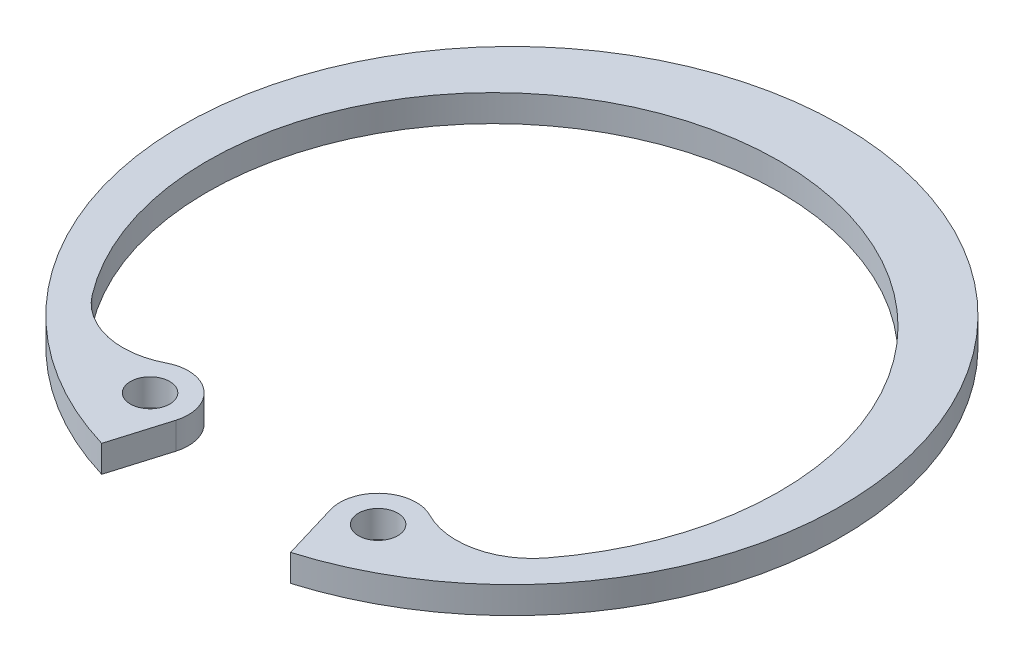
ISO-10303-21;
HEADER;
FILE_DESCRIPTION(('STEP AP214'),'2;1');
FILE_NAME('part.step','',(''),(''),'','','');
FILE_SCHEMA(('AUTOMOTIVE_DESIGN { 1 0 10303 214 1 1 1 1 }'));
ENDSEC;
DATA;
#1=APPLICATION_CONTEXT('core data for automotive mechanical design processes');
#2=APPLICATION_PROTOCOL_DEFINITION('international standard','automotive_design',2000,#1);
#3=PRODUCT_CONTEXT('',#1,'mechanical');
#4=PRODUCT('Part','Part','',(#3));
#5=PRODUCT_RELATED_PRODUCT_CATEGORY('part','',(#4));
#6=PRODUCT_DEFINITION_FORMATION('','',#4);
#7=PRODUCT_DEFINITION_CONTEXT('part definition',#1,'design');
#8=PRODUCT_DEFINITION('design','',#6,#7);
#9=PRODUCT_DEFINITION_SHAPE('','',#8);
#10=(LENGTH_UNIT() NAMED_UNIT(*) SI_UNIT(.MILLI.,.METRE.));
#11=(NAMED_UNIT(*) PLANE_ANGLE_UNIT() SI_UNIT($,.RADIAN.));
#12=(NAMED_UNIT(*) SI_UNIT($,.STERADIAN.) SOLID_ANGLE_UNIT());
#13=UNCERTAINTY_MEASURE_WITH_UNIT(LENGTH_MEASURE(1.E-05),#10,'distance_accuracy_value','');
#14=(GEOMETRIC_REPRESENTATION_CONTEXT(3) GLOBAL_UNCERTAINTY_ASSIGNED_CONTEXT((#13)) GLOBAL_UNIT_ASSIGNED_CONTEXT((#10,
#11,#12)) REPRESENTATION_CONTEXT('',''));
#15=CARTESIAN_POINT('',(0.,0.,0.));
#16=DIRECTION('',(0.,0.,1.));
#17=DIRECTION('',(1.,0.,0.));
#18=AXIS2_PLACEMENT_3D('',#15,#16,#17);
#19=CARTESIAN_POINT('',(0.,1.3,0.9));
#20=DIRECTION('',(0.,-1.,0.));
#21=DIRECTION('',(0.,0.,-1.));
#22=AXIS2_PLACEMENT_3D('',#19,#20,#21);
#23=CYLINDRICAL_SURFACE('',#22,13.85);
#24=CARTESIAN_POINT('',(0.,0.,0.9));
#25=DIRECTION('',(0.,1.,0.));
#26=DIRECTION('',(0.,0.,1.));
#27=AXIS2_PLACEMENT_3D('',#24,#25,#26);
#28=CIRCLE('',#27,13.85);
#29=CARTESIAN_POINT('',(11.0061736504425,0.,9.30753480969928));
#30=VERTEX_POINT('',#29);
#31=CARTESIAN_POINT('',(-11.0061736504425,0.,9.30753480969928));
#32=VERTEX_POINT('',#31);
#33=EDGE_CURVE('E149',#30,#32,#28,.T.);
#34=ORIENTED_EDGE('',*,*,#33,.F.);
#35=DIRECTION('',(0.,-1.,0.));
#36=VECTOR('',#35,1.);
#37=CARTESIAN_POINT('',(11.0061736504425,1.3,9.30753480969928));
#38=LINE('',#37,#36);
#39=CARTESIAN_POINT('',(11.0061736504425,1.3,9.30753480969928));
#40=VERTEX_POINT('',#39);
#41=EDGE_CURVE('E11',#40,#30,#38,.T.);
#42=ORIENTED_EDGE('',*,*,#41,.F.);
#43=CARTESIAN_POINT('',(0.,1.3,0.9));
#44=DIRECTION('',(0.,1.,0.));
#45=DIRECTION('',(0.,0.,1.));
#46=AXIS2_PLACEMENT_3D('',#43,#44,#45);
#47=CIRCLE('',#46,13.85);
#48=CARTESIAN_POINT('',(-11.0061736504425,1.3,9.30753480969928));
#49=VERTEX_POINT('',#48);
#50=EDGE_CURVE('E248',#40,#49,#47,.T.);
#51=ORIENTED_EDGE('',*,*,#50,.T.);
#52=DIRECTION('',(0.,-1.,0.));
#53=VECTOR('',#52,1.);
#54=CARTESIAN_POINT('',(-11.0061736504425,1.3,9.30753480969928));
#55=LINE('',#54,#53);
#56=EDGE_CURVE('E59',#49,#32,#55,.T.);
#57=ORIENTED_EDGE('',*,*,#56,.T.);
#58=EDGE_LOOP('',(#34,#42,#51,#57));
#59=FACE_BOUND('',#58,.T.);
#60=ADVANCED_FACE('F41',(#59),#23,.F.);
#61=CARTESIAN_POINT('',(8.06589621314017,1.3,7.06147857894929));
#62=DIRECTION('',(0.,-1.,0.));
#63=DIRECTION('',(0.,0.,-1.));
#64=AXIS2_PLACEMENT_3D('',#61,#62,#63);
#65=CYLINDRICAL_SURFACE('',#64,3.7);
#66=CARTESIAN_POINT('',(8.06589621314017,0.,7.06147857894929));
#67=DIRECTION('',(0.,1.,0.));
#68=DIRECTION('',(0.,0.,1.));
#69=AXIS2_PLACEMENT_3D('',#66,#67,#68);
#70=CIRCLE('',#69,3.7);
#71=CARTESIAN_POINT('',(6.36678517420886,0.,10.3482736254013));
#72=VERTEX_POINT('',#71);
#73=EDGE_CURVE('E152',#30,#72,#70,.F.);
#74=ORIENTED_EDGE('',*,*,#73,.T.);
#75=DIRECTION('',(0.,-1.,0.));
#76=VECTOR('',#75,1.);
#77=CARTESIAN_POINT('',(6.36678517420886,1.3,10.3482736254013));
#78=LINE('',#77,#76);
#79=CARTESIAN_POINT('',(6.36678517420886,1.3,10.3482736254013));
#80=VERTEX_POINT('',#79);
#81=EDGE_CURVE('E51',#80,#72,#78,.T.);
#82=ORIENTED_EDGE('',*,*,#81,.F.);
#83=CARTESIAN_POINT('',(8.06589621314017,1.3,7.06147857894929));
#84=DIRECTION('',(0.,1.,0.));
#85=DIRECTION('',(0.,0.,1.));
#86=AXIS2_PLACEMENT_3D('',#83,#84,#85);
#87=CIRCLE('',#86,3.7);
#88=EDGE_CURVE('E251',#40,#80,#87,.F.);
#89=ORIENTED_EDGE('',*,*,#88,.F.);
#90=ORIENTED_EDGE('',*,*,#41,.T.);
#91=EDGE_LOOP('',(#74,#82,#89,#90));
#92=FACE_BOUND('',#91,.T.);
#93=ADVANCED_FACE('F206',(#92),#65,.F.);
#94=CARTESIAN_POINT('',(5.51722965474321,1.3,11.9916711486274));
#95=DIRECTION('',(0.,-1.,0.));
#96=DIRECTION('',(0.,0.,-1.));
#97=AXIS2_PLACEMENT_3D('',#94,#95,#96);
#98=CYLINDRICAL_SURFACE('',#97,1.85);
#99=CARTESIAN_POINT('',(5.51722965474321,0.,11.9916711486274));
#100=DIRECTION('',(0.,1.,0.));
#101=DIRECTION('',(0.,0.,1.));
#102=AXIS2_PLACEMENT_3D('',#99,#100,#101);
#103=CIRCLE('',#102,1.85);
#104=CARTESIAN_POINT('',(3.74479479073792,0.,12.5217415711738));
#105=VERTEX_POINT('',#104);
#106=EDGE_CURVE('E156',#72,#105,#103,.T.);
#107=ORIENTED_EDGE('',*,*,#106,.T.);
#108=DIRECTION('',(0.,-1.,0.));
#109=VECTOR('',#108,1.);
#110=CARTESIAN_POINT('',(3.74479479073792,1.3,12.5217415711738));
#111=LINE('',#110,#109);
#112=CARTESIAN_POINT('',(3.74479479073792,1.3,12.5217415711738));
#113=VERTEX_POINT('',#112);
#114=EDGE_CURVE('E192',#113,#105,#111,.T.);
#115=ORIENTED_EDGE('',*,*,#114,.F.);
#116=CARTESIAN_POINT('',(5.51722965474321,1.3,11.9916711486274));
#117=DIRECTION('',(0.,1.,0.));
#118=DIRECTION('',(0.,0.,1.));
#119=AXIS2_PLACEMENT_3D('',#116,#117,#118);
#120=CIRCLE('',#119,1.85);
#121=EDGE_CURVE('E202',#80,#113,#120,.T.);
#122=ORIENTED_EDGE('',*,*,#121,.F.);
#123=ORIENTED_EDGE('',*,*,#81,.T.);
#124=EDGE_LOOP('',(#107,#115,#122,#123));
#125=FACE_BOUND('',#124,.T.);
#126=ADVANCED_FACE('F199',(#125),#98,.T.);
#127=CARTESIAN_POINT('',(0.,1.3,0.));
#128=DIRECTION('',(0.958072899462319,0.,-0.286524552727799));
#129=DIRECTION('',(-0.286524552727799,0.,-0.958072899462319));
#130=AXIS2_PLACEMENT_3D('',#127,#128,#129);
#131=PLANE('',#130);
#132=DIRECTION('',(0.286524552727799,0.,0.958072899462319));
#133=VECTOR('',#132,1.);
#134=CARTESIAN_POINT('',(0.,0.,0.));
#135=LINE('',#134,#133);
#136=CARTESIAN_POINT('',(4.5700666160084,0.,15.281262746424));
#137=VERTEX_POINT('',#136);
#138=EDGE_CURVE('E160',#105,#137,#135,.T.);
#139=ORIENTED_EDGE('',*,*,#138,.T.);
#140=DIRECTION('',(0.,-1.,0.));
#141=VECTOR('',#140,1.);
#142=CARTESIAN_POINT('',(4.5700666160084,1.3,15.281262746424));
#143=LINE('',#142,#141);
#144=CARTESIAN_POINT('',(4.5700666160084,1.3,15.281262746424));
#145=VERTEX_POINT('',#144);
#146=EDGE_CURVE('E188',#145,#137,#143,.T.);
#147=ORIENTED_EDGE('',*,*,#146,.F.);
#148=DIRECTION('',(0.286524552727799,0.,0.958072899462319));
#149=VECTOR('',#148,1.);
#150=CARTESIAN_POINT('',(0.,1.3,0.));
#151=LINE('',#150,#149);
#152=EDGE_CURVE('E258',#113,#145,#151,.T.);
#153=ORIENTED_EDGE('',*,*,#152,.F.);
#154=ORIENTED_EDGE('',*,*,#114,.T.);
#155=EDGE_LOOP('',(#139,#147,#153,#154));
#156=FACE_BOUND('',#155,.T.);
#157=ADVANCED_FACE('F218',(#156),#131,.F.);
#158=CARTESIAN_POINT('',(0.,1.3,0.));
#159=DIRECTION('',(0.,-1.,0.));
#160=DIRECTION('',(0.,0.,-1.));
#161=AXIS2_PLACEMENT_3D('',#158,#159,#160);
#162=CYLINDRICAL_SURFACE('',#161,15.95);
#163=CARTESIAN_POINT('',(0.,0.,0.));
#164=DIRECTION('',(0.,1.,0.));
#165=DIRECTION('',(0.,0.,1.));
#166=AXIS2_PLACEMENT_3D('',#163,#164,#165);
#167=CIRCLE('',#166,15.95);
#168=CARTESIAN_POINT('',(-4.5700666160084,0.,15.281262746424));
#169=VERTEX_POINT('',#168);
#170=EDGE_CURVE('E164',#137,#169,#167,.T.);
#171=ORIENTED_EDGE('',*,*,#170,.T.);
#172=DIRECTION('',(0.,-1.,0.));
#173=VECTOR('',#172,1.);
#174=CARTESIAN_POINT('',(-4.5700666160084,1.3,15.281262746424));
#175=LINE('',#174,#173);
#176=CARTESIAN_POINT('',(-4.5700666160084,1.3,15.281262746424));
#177=VERTEX_POINT('',#176);
#178=EDGE_CURVE('E119',#177,#169,#175,.T.);
#179=ORIENTED_EDGE('',*,*,#178,.F.);
#180=CARTESIAN_POINT('',(0.,1.3,0.));
#181=DIRECTION('',(0.,1.,0.));
#182=DIRECTION('',(0.,0.,1.));
#183=AXIS2_PLACEMENT_3D('',#180,#181,#182);
#184=CIRCLE('',#183,15.95);
#185=EDGE_CURVE('E129',#145,#177,#184,.T.);
#186=ORIENTED_EDGE('',*,*,#185,.F.);
#187=ORIENTED_EDGE('',*,*,#146,.T.);
#188=EDGE_LOOP('',(#171,#179,#186,#187));
#189=FACE_BOUND('',#188,.T.);
#190=ADVANCED_FACE('F221',(#189),#162,.T.);
#191=CARTESIAN_POINT('',(0.,1.3,0.));
#192=DIRECTION('',(0.958072899462319,0.,0.286524552727799));
#193=DIRECTION('',(0.286524552727799,0.,-0.958072899462319));
#194=AXIS2_PLACEMENT_3D('',#191,#192,#193);
#195=PLANE('',#194);
#196=DIRECTION('',(-0.286524552727799,0.,0.958072899462319));
#197=VECTOR('',#196,1.);
#198=CARTESIAN_POINT('',(0.,0.,0.));
#199=LINE('',#198,#197);
#200=CARTESIAN_POINT('',(-3.74479479073792,0.,12.5217415711738));
#201=VERTEX_POINT('',#200);
#202=EDGE_CURVE('E114',#201,#169,#199,.T.);
#203=ORIENTED_EDGE('',*,*,#202,.F.);
#204=DIRECTION('',(0.,-1.,0.));
#205=VECTOR('',#204,1.);
#206=CARTESIAN_POINT('',(-3.74479479073792,1.3,12.5217415711738));
#207=LINE('',#206,#205);
#208=CARTESIAN_POINT('',(-3.74479479073792,1.3,12.5217415711738));
#209=VERTEX_POINT('',#208);
#210=EDGE_CURVE('E109',#209,#201,#207,.T.);
#211=ORIENTED_EDGE('',*,*,#210,.F.);
#212=DIRECTION('',(-0.286524552727799,0.,0.958072899462319));
#213=VECTOR('',#212,1.);
#214=CARTESIAN_POINT('',(0.,1.3,0.));
#215=LINE('',#214,#213);
#216=EDGE_CURVE('E112',#209,#177,#215,.T.);
#217=ORIENTED_EDGE('',*,*,#216,.T.);
#218=ORIENTED_EDGE('',*,*,#178,.T.);
#219=EDGE_LOOP('',(#203,#211,#217,#218));
#220=FACE_BOUND('',#219,.T.);
#221=ADVANCED_FACE('F111',(#220),#195,.T.);
#222=CARTESIAN_POINT('',(-5.51722965474321,1.3,11.9916711486274));
#223=DIRECTION('',(0.,-1.,0.));
#224=DIRECTION('',(0.,0.,-1.));
#225=AXIS2_PLACEMENT_3D('',#222,#223,#224);
#226=CYLINDRICAL_SURFACE('',#225,1.85);
#227=CARTESIAN_POINT('',(-5.51722965474321,0.,11.9916711486274));
#228=DIRECTION('',(0.,1.,0.));
#229=DIRECTION('',(0.,0.,1.));
#230=AXIS2_PLACEMENT_3D('',#227,#228,#229);
#231=CIRCLE('',#230,1.85);
#232=CARTESIAN_POINT('',(-6.36678517420886,0.,10.3482736254013));
#233=VERTEX_POINT('',#232);
#234=EDGE_CURVE('E170',#233,#201,#231,.F.);
#235=ORIENTED_EDGE('',*,*,#234,.F.);
#236=DIRECTION('',(0.,-1.,0.));
#237=VECTOR('',#236,1.);
#238=CARTESIAN_POINT('',(-6.36678517420886,1.3,10.3482736254013));
#239=LINE('',#238,#237);
#240=CARTESIAN_POINT('',(-6.36678517420886,1.3,10.3482736254013));
#241=VERTEX_POINT('',#240);
#242=EDGE_CURVE('E84',#241,#233,#239,.T.);
#243=ORIENTED_EDGE('',*,*,#242,.F.);
#244=CARTESIAN_POINT('',(-5.51722965474321,1.3,11.9916711486274));
#245=DIRECTION('',(0.,1.,0.));
#246=DIRECTION('',(0.,0.,1.));
#247=AXIS2_PLACEMENT_3D('',#244,#245,#246);
#248=CIRCLE('',#247,1.85);
#249=EDGE_CURVE('E127',#241,#209,#248,.F.);
#250=ORIENTED_EDGE('',*,*,#249,.T.);
#251=ORIENTED_EDGE('',*,*,#210,.T.);
#252=EDGE_LOOP('',(#235,#243,#250,#251));
#253=FACE_BOUND('',#252,.T.);
#254=ADVANCED_FACE('F133',(#253),#226,.T.);
#255=CARTESIAN_POINT('',(-8.06589621314017,1.3,7.06147857894929));
#256=DIRECTION('',(0.,-1.,0.));
#257=DIRECTION('',(0.,0.,-1.));
#258=AXIS2_PLACEMENT_3D('',#255,#256,#257);
#259=CYLINDRICAL_SURFACE('',#258,3.7);
#260=CARTESIAN_POINT('',(-8.06589621314017,0.,7.06147857894929));
#261=DIRECTION('',(0.,1.,0.));
#262=DIRECTION('',(0.,0.,1.));
#263=AXIS2_PLACEMENT_3D('',#260,#261,#262);
#264=CIRCLE('',#263,3.7);
#265=EDGE_CURVE('E173',#32,#233,#264,.T.);
#266=ORIENTED_EDGE('',*,*,#265,.F.);
#267=ORIENTED_EDGE('',*,*,#56,.F.);
#268=CARTESIAN_POINT('',(-8.06589621314017,1.3,7.06147857894929));
#269=DIRECTION('',(0.,1.,0.));
#270=DIRECTION('',(0.,0.,1.));
#271=AXIS2_PLACEMENT_3D('',#268,#269,#270);
#272=CIRCLE('',#271,3.7);
#273=EDGE_CURVE('E135',#49,#241,#272,.T.);
#274=ORIENTED_EDGE('',*,*,#273,.T.);
#275=ORIENTED_EDGE('',*,*,#242,.T.);
#276=EDGE_LOOP('',(#266,#267,#274,#275));
#277=FACE_BOUND('',#276,.T.);
#278=ADVANCED_FACE('F230',(#277),#259,.F.);
#279=CARTESIAN_POINT('',(5.51722965474321,1.3,11.9916711486274));
#280=DIRECTION('',(0.,-1.,0.));
#281=DIRECTION('',(0.,0.,-1.));
#282=AXIS2_PLACEMENT_3D('',#279,#280,#281);
#283=CYLINDRICAL_SURFACE('',#282,0.949999999999999);
#284=CARTESIAN_POINT('',(5.51722965474321,1.3,11.9916711486274));
#285=DIRECTION('',(0.,1.,0.));
#286=DIRECTION('',(0.,0.,1.));
#287=AXIS2_PLACEMENT_3D('',#284,#285,#286);
#288=CIRCLE('',#287,0.949999999999999);
#289=CARTESIAN_POINT('',(5.51722965474321,1.3,12.9416711486274));
#290=VERTEX_POINT('',#289);
#291=EDGE_CURVE('E181',#290,#290,#288,.T.);
#292=ORIENTED_EDGE('',*,*,#291,.T.);
#293=EDGE_LOOP('',(#292));
#294=FACE_BOUND('',#293,.T.);
#295=CARTESIAN_POINT('',(5.51722965474321,0.,11.9916711486274));
#296=DIRECTION('',(0.,1.,0.));
#297=DIRECTION('',(0.,0.,1.));
#298=AXIS2_PLACEMENT_3D('',#295,#296,#297);
#299=CIRCLE('',#298,0.949999999999999);
#300=CARTESIAN_POINT('',(5.51722965474321,0.,12.9416711486274));
#301=VERTEX_POINT('',#300);
#302=EDGE_CURVE('E145',#301,#301,#299,.T.);
#303=ORIENTED_EDGE('',*,*,#302,.F.);
#304=EDGE_LOOP('',(#303));
#305=FACE_BOUND('',#304,.T.);
#306=ADVANCED_FACE('F43',(#294,#305),#283,.F.);
#307=CARTESIAN_POINT('',(-5.51722965474321,1.3,11.9916711486274));
#308=DIRECTION('',(0.,-1.,0.));
#309=DIRECTION('',(0.,0.,-1.));
#310=AXIS2_PLACEMENT_3D('',#307,#308,#309);
#311=CYLINDRICAL_SURFACE('',#310,0.949999999999999);
#312=CARTESIAN_POINT('',(-5.51722965474321,1.3,11.9916711486274));
#313=DIRECTION('',(0.,1.,0.));
#314=DIRECTION('',(0.,0.,1.));
#315=AXIS2_PLACEMENT_3D('',#312,#313,#314);
#316=CIRCLE('',#315,0.949999999999999);
#317=CARTESIAN_POINT('',(-5.51722965474321,1.3,12.9416711486274));
#318=VERTEX_POINT('',#317);
#319=EDGE_CURVE('E138',#318,#318,#316,.F.);
#320=ORIENTED_EDGE('',*,*,#319,.F.);
#321=EDGE_LOOP('',(#320));
#322=FACE_BOUND('',#321,.T.);
#323=CARTESIAN_POINT('',(-5.51722965474321,0.,11.9916711486274));
#324=DIRECTION('',(0.,1.,0.));
#325=DIRECTION('',(0.,0.,1.));
#326=AXIS2_PLACEMENT_3D('',#323,#324,#325);
#327=CIRCLE('',#326,0.949999999999999);
#328=CARTESIAN_POINT('',(-5.51722965474321,0.,12.9416711486274));
#329=VERTEX_POINT('',#328);
#330=EDGE_CURVE('E177',#329,#329,#327,.F.);
#331=ORIENTED_EDGE('',*,*,#330,.T.);
#332=EDGE_LOOP('',(#331));
#333=FACE_BOUND('',#332,.T.);
#334=ADVANCED_FACE('F233',(#322,#333),#311,.F.);
#335=CARTESIAN_POINT('',(0.,1.3,0.));
#336=DIRECTION('',(0.,1.,0.));
#337=DIRECTION('',(0.,0.,1.));
#338=AXIS2_PLACEMENT_3D('',#335,#336,#337);
#339=PLANE('',#338);
#340=ORIENTED_EDGE('',*,*,#291,.F.);
#341=EDGE_LOOP('',(#340));
#342=FACE_BOUND('',#341,.T.);
#343=ORIENTED_EDGE('',*,*,#50,.F.);
#344=ORIENTED_EDGE('',*,*,#88,.T.);
#345=ORIENTED_EDGE('',*,*,#121,.T.);
#346=ORIENTED_EDGE('',*,*,#152,.T.);
#347=ORIENTED_EDGE('',*,*,#185,.T.);
#348=ORIENTED_EDGE('',*,*,#216,.F.);
#349=ORIENTED_EDGE('',*,*,#249,.F.);
#350=ORIENTED_EDGE('',*,*,#273,.F.);
#351=EDGE_LOOP('',(#343,#344,#345,#346,#347,#348,#349,#350));
#352=FACE_BOUND('',#351,.T.);
#353=ORIENTED_EDGE('',*,*,#319,.T.);
#354=EDGE_LOOP('',(#353));
#355=FACE_BOUND('',#354,.T.);
#356=ADVANCED_FACE('F124',(#342,#352,#355),#339,.T.);
#357=CARTESIAN_POINT('',(0.,0.,0.));
#358=DIRECTION('',(0.,1.,0.));
#359=DIRECTION('',(0.,0.,1.));
#360=AXIS2_PLACEMENT_3D('',#357,#358,#359);
#361=PLANE('',#360);
#362=ORIENTED_EDGE('',*,*,#302,.T.);
#363=EDGE_LOOP('',(#362));
#364=FACE_BOUND('',#363,.T.);
#365=ORIENTED_EDGE('',*,*,#33,.T.);
#366=ORIENTED_EDGE('',*,*,#265,.T.);
#367=ORIENTED_EDGE('',*,*,#234,.T.);
#368=ORIENTED_EDGE('',*,*,#202,.T.);
#369=ORIENTED_EDGE('',*,*,#170,.F.);
#370=ORIENTED_EDGE('',*,*,#138,.F.);
#371=ORIENTED_EDGE('',*,*,#106,.F.);
#372=ORIENTED_EDGE('',*,*,#73,.F.);
#373=EDGE_LOOP('',(#365,#366,#367,#368,#369,#370,#371,#372));
#374=FACE_BOUND('',#373,.T.);
#375=ORIENTED_EDGE('',*,*,#330,.F.);
#376=EDGE_LOOP('',(#375));
#377=FACE_BOUND('',#376,.T.);
#378=ADVANCED_FACE('F208',(#364,#374,#377),#361,.F.);
#379=CLOSED_SHELL('',(#60,#93,#126,#157,#190,#221,#254,#278,#306,#334,#356,#378));
#380=MANIFOLD_SOLID_BREP('B2',#379);
#381=ADVANCED_BREP_SHAPE_REPRESENTATION('',(#18,#380),#14);
#382=SHAPE_DEFINITION_REPRESENTATION(#9,#381);
ENDSEC;
END-ISO-10303-21;
